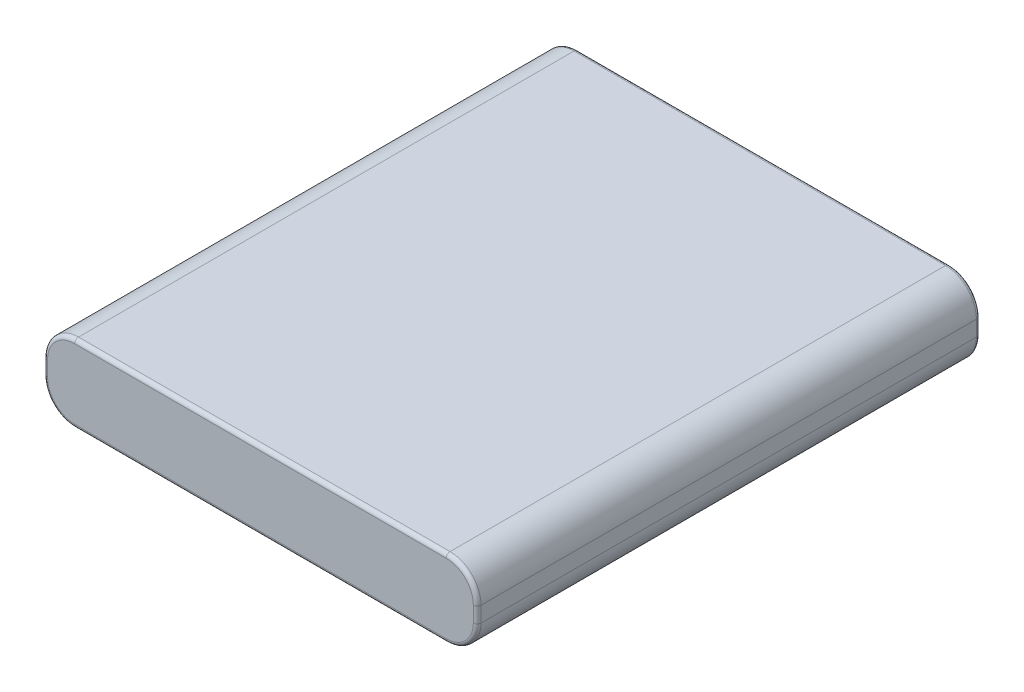
ISO-10303-21;
HEADER;
FILE_DESCRIPTION(('STEP AP214'),'2;1');
FILE_NAME('part.step','',(''),(''),'','','');
FILE_SCHEMA(('AUTOMOTIVE_DESIGN { 1 0 10303 214 1 1 1 1 }'));
ENDSEC;
DATA;
#1=APPLICATION_CONTEXT('core data for automotive mechanical design processes');
#2=APPLICATION_PROTOCOL_DEFINITION('international standard','automotive_design',2000,#1);
#3=PRODUCT_CONTEXT('',#1,'mechanical');
#4=PRODUCT('Part','Part','',(#3));
#5=PRODUCT_RELATED_PRODUCT_CATEGORY('part','',(#4));
#6=PRODUCT_DEFINITION_FORMATION('','',#4);
#7=PRODUCT_DEFINITION_CONTEXT('part definition',#1,'design');
#8=PRODUCT_DEFINITION('design','',#6,#7);
#9=PRODUCT_DEFINITION_SHAPE('','',#8);
#10=(LENGTH_UNIT() NAMED_UNIT(*) SI_UNIT(.MILLI.,.METRE.));
#11=(NAMED_UNIT(*) PLANE_ANGLE_UNIT() SI_UNIT($,.RADIAN.));
#12=(NAMED_UNIT(*) SI_UNIT($,.STERADIAN.) SOLID_ANGLE_UNIT());
#13=UNCERTAINTY_MEASURE_WITH_UNIT(LENGTH_MEASURE(1.E-05),#10,'distance_accuracy_value','');
#14=(GEOMETRIC_REPRESENTATION_CONTEXT(3) GLOBAL_UNCERTAINTY_ASSIGNED_CONTEXT((#13)) GLOBAL_UNIT_ASSIGNED_CONTEXT((#10,
#11,#12)) REPRESENTATION_CONTEXT('',''));
#15=CARTESIAN_POINT('',(0.,0.,0.));
#16=DIRECTION('',(0.,0.,1.));
#17=DIRECTION('',(1.,0.,0.));
#18=AXIS2_PLACEMENT_3D('',#15,#16,#17);
#19=CARTESIAN_POINT('',(28.,10.,-32.5));
#20=DIRECTION('',(-1.,0.,0.));
#21=DIRECTION('',(0.,0.,1.));
#22=AXIS2_PLACEMENT_3D('',#19,#20,#21);
#23=PLANE('',#22);
#24=DIRECTION('',(0.,0.,-1.));
#25=VECTOR('',#24,1.);
#26=CARTESIAN_POINT('',(28.,4.,-32.5));
#27=LINE('',#26,#25);
#28=CARTESIAN_POINT('',(28.,4.,32.));
#29=VERTEX_POINT('',#28);
#30=CARTESIAN_POINT('',(28.,4.,-32.));
#31=VERTEX_POINT('',#30);
#32=EDGE_CURVE('E279',#29,#31,#27,.T.);
#33=ORIENTED_EDGE('',*,*,#32,.T.);
#34=DIRECTION('',(0.,-1.,0.));
#35=VECTOR('',#34,1.);
#36=CARTESIAN_POINT('',(28.,10.,-32.));
#37=LINE('',#36,#35);
#38=CARTESIAN_POINT('',(28.,6.,-32.));
#39=VERTEX_POINT('',#38);
#40=EDGE_CURVE('E183',#31,#39,#37,.F.);
#41=ORIENTED_EDGE('',*,*,#40,.T.);
#42=DIRECTION('',(0.,0.,-1.));
#43=VECTOR('',#42,1.);
#44=CARTESIAN_POINT('',(28.,6.,32.5));
#45=LINE('',#44,#43);
#46=CARTESIAN_POINT('',(28.,6.,32.));
#47=VERTEX_POINT('',#46);
#48=EDGE_CURVE('E287',#39,#47,#45,.F.);
#49=ORIENTED_EDGE('',*,*,#48,.T.);
#50=DIRECTION('',(0.,-1.,0.));
#51=VECTOR('',#50,1.);
#52=CARTESIAN_POINT('',(28.,10.,32.));
#53=LINE('',#52,#51);
#54=EDGE_CURVE('E181',#47,#29,#53,.T.);
#55=ORIENTED_EDGE('',*,*,#54,.T.);
#56=EDGE_LOOP('',(#33,#41,#49,#55));
#57=FACE_BOUND('',#56,.T.);
#58=ADVANCED_FACE('F33',(#57),#23,.F.);
#59=CARTESIAN_POINT('',(-28.,10.,-32.5));
#60=DIRECTION('',(0.,0.,1.));
#61=DIRECTION('',(1.,0.,0.));
#62=AXIS2_PLACEMENT_3D('',#59,#60,#61);
#63=PLANE('',#62);
#64=DIRECTION('',(0.,-1.,0.));
#65=VECTOR('',#64,1.);
#66=CARTESIAN_POINT('',(27.5,10.,-32.5));
#67=LINE('',#66,#65);
#68=CARTESIAN_POINT('',(27.5,6.,-32.5));
#69=VERTEX_POINT('',#68);
#70=CARTESIAN_POINT('',(27.5,4.,-32.5));
#71=VERTEX_POINT('',#70);
#72=EDGE_CURVE('E171',#69,#71,#67,.T.);
#73=ORIENTED_EDGE('',*,*,#72,.T.);
#74=CARTESIAN_POINT('',(24.,4.,-32.5));
#75=DIRECTION('',(0.,0.,1.));
#76=DIRECTION('',(1.,0.,0.));
#77=AXIS2_PLACEMENT_3D('',#74,#75,#76);
#78=CIRCLE('',#77,3.5);
#79=CARTESIAN_POINT('',(24.,0.5,-32.5));
#80=VERTEX_POINT('',#79);
#81=EDGE_CURVE('E151',#71,#80,#78,.F.);
#82=ORIENTED_EDGE('',*,*,#81,.T.);
#83=DIRECTION('',(-1.,0.,0.));
#84=VECTOR('',#83,1.);
#85=CARTESIAN_POINT('',(-28.,0.5,-32.5));
#86=LINE('',#85,#84);
#87=CARTESIAN_POINT('',(-24.,0.5,-32.5));
#88=VERTEX_POINT('',#87);
#89=EDGE_CURVE('E160',#80,#88,#86,.T.);
#90=ORIENTED_EDGE('',*,*,#89,.T.);
#91=CARTESIAN_POINT('',(-24.,4.,-32.5));
#92=DIRECTION('',(0.,0.,1.));
#93=DIRECTION('',(1.,0.,0.));
#94=AXIS2_PLACEMENT_3D('',#91,#92,#93);
#95=CIRCLE('',#94,3.5);
#96=CARTESIAN_POINT('',(-27.5,4.,-32.5));
#97=VERTEX_POINT('',#96);
#98=EDGE_CURVE('E166',#88,#97,#95,.F.);
#99=ORIENTED_EDGE('',*,*,#98,.T.);
#100=DIRECTION('',(0.,-1.,0.));
#101=VECTOR('',#100,1.);
#102=CARTESIAN_POINT('',(-27.5,10.,-32.5));
#103=LINE('',#102,#101);
#104=CARTESIAN_POINT('',(-27.5,6.,-32.5));
#105=VERTEX_POINT('',#104);
#106=EDGE_CURVE('E302',#97,#105,#103,.F.);
#107=ORIENTED_EDGE('',*,*,#106,.T.);
#108=CARTESIAN_POINT('',(-24.,6.,-32.5));
#109=DIRECTION('',(0.,0.,1.));
#110=DIRECTION('',(1.,0.,0.));
#111=AXIS2_PLACEMENT_3D('',#108,#109,#110);
#112=CIRCLE('',#111,3.5);
#113=CARTESIAN_POINT('',(-24.,9.5,-32.5));
#114=VERTEX_POINT('',#113);
#115=EDGE_CURVE('E304',#105,#114,#112,.F.);
#116=ORIENTED_EDGE('',*,*,#115,.T.);
#117=DIRECTION('',(-1.,0.,0.));
#118=VECTOR('',#117,1.);
#119=CARTESIAN_POINT('',(24.,9.5,-32.5));
#120=LINE('',#119,#118);
#121=CARTESIAN_POINT('',(24.,9.5,-32.5));
#122=VERTEX_POINT('',#121);
#123=EDGE_CURVE('E306',#114,#122,#120,.F.);
#124=ORIENTED_EDGE('',*,*,#123,.T.);
#125=CARTESIAN_POINT('',(24.,6.,-32.5));
#126=DIRECTION('',(0.,0.,1.));
#127=DIRECTION('',(1.,0.,0.));
#128=AXIS2_PLACEMENT_3D('',#125,#126,#127);
#129=CIRCLE('',#128,3.5);
#130=EDGE_CURVE('E176',#122,#69,#129,.F.);
#131=ORIENTED_EDGE('',*,*,#130,.T.);
#132=EDGE_LOOP('',(#73,#82,#90,#99,#107,#116,#124,#131));
#133=FACE_BOUND('',#132,.T.);
#134=ADVANCED_FACE('F169',(#133),#63,.F.);
#135=CARTESIAN_POINT('',(-28.,10.,-32.5));
#136=DIRECTION('',(1.,0.,0.));
#137=DIRECTION('',(0.,0.,-1.));
#138=AXIS2_PLACEMENT_3D('',#135,#136,#137);
#139=PLANE('',#138);
#140=DIRECTION('',(0.,0.,1.));
#141=VECTOR('',#140,1.);
#142=CARTESIAN_POINT('',(-28.,6.,-32.5));
#143=LINE('',#142,#141);
#144=CARTESIAN_POINT('',(-28.,6.,32.));
#145=VERTEX_POINT('',#144);
#146=CARTESIAN_POINT('',(-28.,6.,-32.));
#147=VERTEX_POINT('',#146);
#148=EDGE_CURVE('E240',#145,#147,#143,.F.);
#149=ORIENTED_EDGE('',*,*,#148,.T.);
#150=DIRECTION('',(0.,-1.,0.));
#151=VECTOR('',#150,1.);
#152=CARTESIAN_POINT('',(-28.,10.,-32.));
#153=LINE('',#152,#151);
#154=CARTESIAN_POINT('',(-28.,4.,-32.));
#155=VERTEX_POINT('',#154);
#156=EDGE_CURVE('E200',#147,#155,#153,.T.);
#157=ORIENTED_EDGE('',*,*,#156,.T.);
#158=DIRECTION('',(0.,0.,1.));
#159=VECTOR('',#158,1.);
#160=CARTESIAN_POINT('',(-28.,4.,-32.5));
#161=LINE('',#160,#159);
#162=CARTESIAN_POINT('',(-28.,4.,32.));
#163=VERTEX_POINT('',#162);
#164=EDGE_CURVE('E285',#155,#163,#161,.T.);
#165=ORIENTED_EDGE('',*,*,#164,.T.);
#166=DIRECTION('',(0.,-1.,0.));
#167=VECTOR('',#166,1.);
#168=CARTESIAN_POINT('',(-28.,10.,32.));
#169=LINE('',#168,#167);
#170=EDGE_CURVE('E198',#163,#145,#169,.F.);
#171=ORIENTED_EDGE('',*,*,#170,.T.);
#172=EDGE_LOOP('',(#149,#157,#165,#171));
#173=FACE_BOUND('',#172,.T.);
#174=ADVANCED_FACE('F348',(#173),#139,.F.);
#175=CARTESIAN_POINT('',(-28.,10.,32.5));
#176=DIRECTION('',(0.,0.,-1.));
#177=DIRECTION('',(-1.,0.,0.));
#178=AXIS2_PLACEMENT_3D('',#175,#176,#177);
#179=PLANE('',#178);
#180=DIRECTION('',(1.,0.,0.));
#181=VECTOR('',#180,1.);
#182=CARTESIAN_POINT('',(-24.,9.5,32.5));
#183=LINE('',#182,#181);
#184=CARTESIAN_POINT('',(24.,9.5,32.5));
#185=VERTEX_POINT('',#184);
#186=CARTESIAN_POINT('',(-24.,9.5,32.5));
#187=VERTEX_POINT('',#186);
#188=EDGE_CURVE('E48',#185,#187,#183,.F.);
#189=ORIENTED_EDGE('',*,*,#188,.T.);
#190=CARTESIAN_POINT('',(-24.,6.,32.5));
#191=DIRECTION('',(0.,0.,-1.));
#192=DIRECTION('',(-1.,0.,0.));
#193=AXIS2_PLACEMENT_3D('',#190,#191,#192);
#194=CIRCLE('',#193,3.5);
#195=CARTESIAN_POINT('',(-27.5,6.,32.5));
#196=VERTEX_POINT('',#195);
#197=EDGE_CURVE('E41',#187,#196,#194,.F.);
#198=ORIENTED_EDGE('',*,*,#197,.T.);
#199=DIRECTION('',(0.,-1.,0.));
#200=VECTOR('',#199,1.);
#201=CARTESIAN_POINT('',(-27.5,10.,32.5));
#202=LINE('',#201,#200);
#203=CARTESIAN_POINT('',(-27.5,4.,32.5));
#204=VERTEX_POINT('',#203);
#205=EDGE_CURVE('E210',#196,#204,#202,.T.);
#206=ORIENTED_EDGE('',*,*,#205,.T.);
#207=CARTESIAN_POINT('',(-24.,4.,32.5));
#208=DIRECTION('',(0.,0.,-1.));
#209=DIRECTION('',(-1.,0.,0.));
#210=AXIS2_PLACEMENT_3D('',#207,#208,#209);
#211=CIRCLE('',#210,3.5);
#212=CARTESIAN_POINT('',(-24.,0.5,32.5));
#213=VERTEX_POINT('',#212);
#214=EDGE_CURVE('E212',#204,#213,#211,.F.);
#215=ORIENTED_EDGE('',*,*,#214,.T.);
#216=DIRECTION('',(1.,0.,0.));
#217=VECTOR('',#216,1.);
#218=CARTESIAN_POINT('',(-28.,0.5,32.5));
#219=LINE('',#218,#217);
#220=CARTESIAN_POINT('',(24.,0.5,32.5));
#221=VERTEX_POINT('',#220);
#222=EDGE_CURVE('E214',#213,#221,#219,.T.);
#223=ORIENTED_EDGE('',*,*,#222,.T.);
#224=CARTESIAN_POINT('',(24.,4.,32.5));
#225=DIRECTION('',(0.,0.,-1.));
#226=DIRECTION('',(-1.,0.,0.));
#227=AXIS2_PLACEMENT_3D('',#224,#225,#226);
#228=CIRCLE('',#227,3.5);
#229=CARTESIAN_POINT('',(27.5,4.,32.5));
#230=VERTEX_POINT('',#229);
#231=EDGE_CURVE('E216',#221,#230,#228,.F.);
#232=ORIENTED_EDGE('',*,*,#231,.T.);
#233=DIRECTION('',(0.,-1.,0.));
#234=VECTOR('',#233,1.);
#235=CARTESIAN_POINT('',(27.5,10.,32.5));
#236=LINE('',#235,#234);
#237=CARTESIAN_POINT('',(27.5,6.,32.5));
#238=VERTEX_POINT('',#237);
#239=EDGE_CURVE('E218',#230,#238,#236,.F.);
#240=ORIENTED_EDGE('',*,*,#239,.T.);
#241=CARTESIAN_POINT('',(24.,6.,32.5));
#242=DIRECTION('',(0.,0.,-1.));
#243=DIRECTION('',(-1.,0.,0.));
#244=AXIS2_PLACEMENT_3D('',#241,#242,#243);
#245=CIRCLE('',#244,3.5);
#246=EDGE_CURVE('E53',#238,#185,#245,.F.);
#247=ORIENTED_EDGE('',*,*,#246,.T.);
#248=EDGE_LOOP('',(#189,#198,#206,#215,#223,#232,#240,#247));
#249=FACE_BOUND('',#248,.T.);
#250=ADVANCED_FACE('F334',(#249),#179,.F.);
#251=CARTESIAN_POINT('',(0.,10.,0.));
#252=DIRECTION('',(0.,1.,0.));
#253=DIRECTION('',(0.,0.,1.));
#254=AXIS2_PLACEMENT_3D('',#251,#252,#253);
#255=PLANE('',#254);
#256=DIRECTION('',(0.,0.,-1.));
#257=VECTOR('',#256,1.);
#258=CARTESIAN_POINT('',(24.,10.,-32.5));
#259=LINE('',#258,#257);
#260=CARTESIAN_POINT('',(24.,10.,32.));
#261=VERTEX_POINT('',#260);
#262=CARTESIAN_POINT('',(24.,10.,-32.));
#263=VERTEX_POINT('',#262);
#264=EDGE_CURVE('E167',#261,#263,#259,.T.);
#265=ORIENTED_EDGE('',*,*,#264,.T.);
#266=DIRECTION('',(-1.,0.,0.));
#267=VECTOR('',#266,1.);
#268=CARTESIAN_POINT('',(-24.,10.,-32.));
#269=LINE('',#268,#267);
#270=CARTESIAN_POINT('',(-24.,10.,-32.));
#271=VERTEX_POINT('',#270);
#272=EDGE_CURVE('E191',#263,#271,#269,.T.);
#273=ORIENTED_EDGE('',*,*,#272,.T.);
#274=DIRECTION('',(0.,0.,1.));
#275=VECTOR('',#274,1.);
#276=CARTESIAN_POINT('',(-24.,10.,32.5));
#277=LINE('',#276,#275);
#278=CARTESIAN_POINT('',(-24.,10.,32.));
#279=VERTEX_POINT('',#278);
#280=EDGE_CURVE('E296',#271,#279,#277,.T.);
#281=ORIENTED_EDGE('',*,*,#280,.T.);
#282=DIRECTION('',(1.,0.,0.));
#283=VECTOR('',#282,1.);
#284=CARTESIAN_POINT('',(24.,10.,32.));
#285=LINE('',#284,#283);
#286=EDGE_CURVE('E189',#279,#261,#285,.T.);
#287=ORIENTED_EDGE('',*,*,#286,.T.);
#288=EDGE_LOOP('',(#265,#273,#281,#287));
#289=FACE_BOUND('',#288,.T.);
#290=ADVANCED_FACE('F369',(#289),#255,.T.);
#291=CARTESIAN_POINT('',(0.,0.,0.));
#292=DIRECTION('',(0.,1.,0.));
#293=DIRECTION('',(0.,0.,1.));
#294=AXIS2_PLACEMENT_3D('',#291,#292,#293);
#295=PLANE('',#294);
#296=CARTESIAN_POINT('',(0.,0.,6.10578674842381));
#297=DIRECTION('',(0.,1.,0.));
#298=DIRECTION('',(0.,0.,1.));
#299=AXIS2_PLACEMENT_3D('',#296,#297,#298);
#300=CIRCLE('',#299,7.);
#301=CARTESIAN_POINT('',(0.,0.,13.1057867484238));
#302=VERTEX_POINT('',#301);
#303=EDGE_CURVE('E11',#302,#302,#300,.F.);
#304=ORIENTED_EDGE('',*,*,#303,.F.);
#305=EDGE_LOOP('',(#304));
#306=FACE_BOUND('',#305,.T.);
#307=DIRECTION('',(0.,0.,1.));
#308=VECTOR('',#307,1.);
#309=CARTESIAN_POINT('',(-24.,0.,0.));
#310=LINE('',#309,#308);
#311=CARTESIAN_POINT('',(-24.,0.,32.));
#312=VERTEX_POINT('',#311);
#313=CARTESIAN_POINT('',(-24.,0.,-32.));
#314=VERTEX_POINT('',#313);
#315=EDGE_CURVE('E284',#312,#314,#310,.F.);
#316=ORIENTED_EDGE('',*,*,#315,.T.);
#317=DIRECTION('',(-1.,0.,0.));
#318=VECTOR('',#317,1.);
#319=CARTESIAN_POINT('',(0.,0.,-32.));
#320=LINE('',#319,#318);
#321=CARTESIAN_POINT('',(24.,0.,-32.));
#322=VERTEX_POINT('',#321);
#323=EDGE_CURVE('E208',#314,#322,#320,.F.);
#324=ORIENTED_EDGE('',*,*,#323,.T.);
#325=DIRECTION('',(0.,0.,-1.));
#326=VECTOR('',#325,1.);
#327=CARTESIAN_POINT('',(24.,0.,0.));
#328=LINE('',#327,#326);
#329=CARTESIAN_POINT('',(24.,0.,32.));
#330=VERTEX_POINT('',#329);
#331=EDGE_CURVE('E277',#322,#330,#328,.F.);
#332=ORIENTED_EDGE('',*,*,#331,.T.);
#333=DIRECTION('',(1.,0.,0.));
#334=VECTOR('',#333,1.);
#335=CARTESIAN_POINT('',(0.,0.,32.));
#336=LINE('',#335,#334);
#337=EDGE_CURVE('E206',#330,#312,#336,.F.);
#338=ORIENTED_EDGE('',*,*,#337,.T.);
#339=EDGE_LOOP('',(#316,#324,#332,#338));
#340=FACE_BOUND('',#339,.T.);
#341=ADVANCED_FACE('F282',(#306,#340),#295,.F.);
#342=CARTESIAN_POINT('',(-24.,4.,-32.5));
#343=DIRECTION('',(0.,0.,1.));
#344=DIRECTION('',(1.,0.,0.));
#345=AXIS2_PLACEMENT_3D('',#342,#343,#344);
#346=CYLINDRICAL_SURFACE('',#345,4.);
#347=ORIENTED_EDGE('',*,*,#164,.F.);
#348=CARTESIAN_POINT('',(-24.,4.,-32.));
#349=DIRECTION('',(0.,0.,1.));
#350=DIRECTION('',(1.,0.,0.));
#351=AXIS2_PLACEMENT_3D('',#348,#349,#350);
#352=CIRCLE('',#351,4.);
#353=EDGE_CURVE('E204',#155,#314,#352,.T.);
#354=ORIENTED_EDGE('',*,*,#353,.T.);
#355=ORIENTED_EDGE('',*,*,#315,.F.);
#356=CARTESIAN_POINT('',(-24.,4.,32.));
#357=DIRECTION('',(0.,0.,-1.));
#358=DIRECTION('',(-1.,0.,0.));
#359=AXIS2_PLACEMENT_3D('',#356,#357,#358);
#360=CIRCLE('',#359,4.);
#361=EDGE_CURVE('E202',#312,#163,#360,.T.);
#362=ORIENTED_EDGE('',*,*,#361,.T.);
#363=EDGE_LOOP('',(#347,#354,#355,#362));
#364=FACE_BOUND('',#363,.T.);
#365=ADVANCED_FACE('F368',(#364),#346,.T.);
#366=CARTESIAN_POINT('',(24.,4.,-32.5));
#367=DIRECTION('',(0.,0.,-1.));
#368=DIRECTION('',(-1.,0.,0.));
#369=AXIS2_PLACEMENT_3D('',#366,#367,#368);
#370=CYLINDRICAL_SURFACE('',#369,4.);
#371=ORIENTED_EDGE('',*,*,#331,.F.);
#372=CARTESIAN_POINT('',(24.,4.,-32.));
#373=DIRECTION('',(0.,0.,1.));
#374=DIRECTION('',(1.,0.,0.));
#375=AXIS2_PLACEMENT_3D('',#372,#373,#374);
#376=CIRCLE('',#375,4.);
#377=EDGE_CURVE('E153',#322,#31,#376,.T.);
#378=ORIENTED_EDGE('',*,*,#377,.T.);
#379=ORIENTED_EDGE('',*,*,#32,.F.);
#380=CARTESIAN_POINT('',(24.,4.,32.));
#381=DIRECTION('',(0.,0.,-1.));
#382=DIRECTION('',(-1.,0.,0.));
#383=AXIS2_PLACEMENT_3D('',#380,#381,#382);
#384=CIRCLE('',#383,4.);
#385=EDGE_CURVE('E173',#29,#330,#384,.T.);
#386=ORIENTED_EDGE('',*,*,#385,.T.);
#387=EDGE_LOOP('',(#371,#378,#379,#386));
#388=FACE_BOUND('',#387,.T.);
#389=ADVANCED_FACE('F276',(#388),#370,.T.);
#390=CARTESIAN_POINT('',(24.,6.,0.));
#391=DIRECTION('',(0.,0.,1.));
#392=DIRECTION('',(1.,0.,0.));
#393=AXIS2_PLACEMENT_3D('',#390,#391,#392);
#394=CYLINDRICAL_SURFACE('',#393,4.);
#395=ORIENTED_EDGE('',*,*,#48,.F.);
#396=CARTESIAN_POINT('',(24.,6.,-32.));
#397=DIRECTION('',(0.,0.,1.));
#398=DIRECTION('',(1.,0.,0.));
#399=AXIS2_PLACEMENT_3D('',#396,#397,#398);
#400=CIRCLE('',#399,4.);
#401=EDGE_CURVE('E187',#39,#263,#400,.T.);
#402=ORIENTED_EDGE('',*,*,#401,.T.);
#403=ORIENTED_EDGE('',*,*,#264,.F.);
#404=CARTESIAN_POINT('',(24.,6.,32.));
#405=DIRECTION('',(0.,0.,-1.));
#406=DIRECTION('',(-1.,0.,0.));
#407=AXIS2_PLACEMENT_3D('',#404,#405,#406);
#408=CIRCLE('',#407,4.);
#409=EDGE_CURVE('E185',#261,#47,#408,.T.);
#410=ORIENTED_EDGE('',*,*,#409,.T.);
#411=EDGE_LOOP('',(#395,#402,#403,#410));
#412=FACE_BOUND('',#411,.T.);
#413=ADVANCED_FACE('F320',(#412),#394,.T.);
#414=CARTESIAN_POINT('',(-24.,6.,0.));
#415=DIRECTION('',(0.,0.,-1.));
#416=DIRECTION('',(-1.,0.,0.));
#417=AXIS2_PLACEMENT_3D('',#414,#415,#416);
#418=CYLINDRICAL_SURFACE('',#417,4.);
#419=ORIENTED_EDGE('',*,*,#280,.F.);
#420=CARTESIAN_POINT('',(-24.,6.,-32.));
#421=DIRECTION('',(0.,0.,1.));
#422=DIRECTION('',(1.,0.,0.));
#423=AXIS2_PLACEMENT_3D('',#420,#421,#422);
#424=CIRCLE('',#423,4.);
#425=EDGE_CURVE('E196',#271,#147,#424,.T.);
#426=ORIENTED_EDGE('',*,*,#425,.T.);
#427=ORIENTED_EDGE('',*,*,#148,.F.);
#428=CARTESIAN_POINT('',(-24.,6.,32.));
#429=DIRECTION('',(0.,0.,-1.));
#430=DIRECTION('',(-1.,0.,0.));
#431=AXIS2_PLACEMENT_3D('',#428,#429,#430);
#432=CIRCLE('',#431,4.);
#433=EDGE_CURVE('E193',#145,#279,#432,.T.);
#434=ORIENTED_EDGE('',*,*,#433,.T.);
#435=EDGE_LOOP('',(#419,#426,#427,#434));
#436=FACE_BOUND('',#435,.T.);
#437=ADVANCED_FACE('F353',(#436),#418,.T.);
#438=CARTESIAN_POINT('',(-24.,6.,-32.));
#439=DIRECTION('',(0.,0.,1.));
#440=DIRECTION('',(1.,0.,0.));
#441=AXIS2_PLACEMENT_3D('',#438,#439,#440);
#442=TOROIDAL_SURFACE('',#441,3.5,0.5);
#443=CARTESIAN_POINT('',(-27.5,6.,-32.));
#444=DIRECTION('',(0.,-1.,0.));
#445=DIRECTION('',(0.,0.,-1.));
#446=AXIS2_PLACEMENT_3D('',#443,#444,#445);
#447=CIRCLE('',#446,0.5);
#448=EDGE_CURVE('E234',#147,#105,#447,.T.);
#449=ORIENTED_EDGE('',*,*,#448,.F.);
#450=ORIENTED_EDGE('',*,*,#425,.F.);
#451=CARTESIAN_POINT('',(-24.,9.5,-32.));
#452=DIRECTION('',(1.,0.,0.));
#453=DIRECTION('',(0.,0.,-1.));
#454=AXIS2_PLACEMENT_3D('',#451,#452,#453);
#455=CIRCLE('',#454,0.5);
#456=EDGE_CURVE('E237',#114,#271,#455,.T.);
#457=ORIENTED_EDGE('',*,*,#456,.F.);
#458=ORIENTED_EDGE('',*,*,#115,.F.);
#459=EDGE_LOOP('',(#449,#450,#457,#458));
#460=FACE_BOUND('',#459,.T.);
#461=ADVANCED_FACE('F394',(#460),#442,.T.);
#462=CARTESIAN_POINT('',(0.,9.5,-32.));
#463=DIRECTION('',(1.,0.,0.));
#464=DIRECTION('',(0.,0.,-1.));
#465=AXIS2_PLACEMENT_3D('',#462,#463,#464);
#466=CYLINDRICAL_SURFACE('',#465,0.5);
#467=ORIENTED_EDGE('',*,*,#456,.T.);
#468=ORIENTED_EDGE('',*,*,#272,.F.);
#469=CARTESIAN_POINT('',(24.,9.5,-32.));
#470=DIRECTION('',(1.,0.,0.));
#471=DIRECTION('',(0.,0.,-1.));
#472=AXIS2_PLACEMENT_3D('',#469,#470,#471);
#473=CIRCLE('',#472,0.5);
#474=EDGE_CURVE('E231',#122,#263,#473,.T.);
#475=ORIENTED_EDGE('',*,*,#474,.F.);
#476=ORIENTED_EDGE('',*,*,#123,.F.);
#477=EDGE_LOOP('',(#467,#468,#475,#476));
#478=FACE_BOUND('',#477,.T.);
#479=ADVANCED_FACE('F410',(#478),#466,.T.);
#480=CARTESIAN_POINT('',(-27.5,10.,-32.));
#481=DIRECTION('',(0.,-1.,0.));
#482=DIRECTION('',(0.,0.,-1.));
#483=AXIS2_PLACEMENT_3D('',#480,#481,#482);
#484=CYLINDRICAL_SURFACE('',#483,0.5);
#485=ORIENTED_EDGE('',*,*,#448,.T.);
#486=ORIENTED_EDGE('',*,*,#106,.F.);
#487=CARTESIAN_POINT('',(-27.5,4.,-32.));
#488=DIRECTION('',(0.,-1.,0.));
#489=DIRECTION('',(0.,0.,-1.));
#490=AXIS2_PLACEMENT_3D('',#487,#488,#489);
#491=CIRCLE('',#490,0.5);
#492=EDGE_CURVE('E228',#155,#97,#491,.T.);
#493=ORIENTED_EDGE('',*,*,#492,.F.);
#494=ORIENTED_EDGE('',*,*,#156,.F.);
#495=EDGE_LOOP('',(#485,#486,#493,#494));
#496=FACE_BOUND('',#495,.T.);
#497=ADVANCED_FACE('F407',(#496),#484,.T.);
#498=CARTESIAN_POINT('',(24.,6.,-32.));
#499=DIRECTION('',(0.,0.,1.));
#500=DIRECTION('',(1.,0.,0.));
#501=AXIS2_PLACEMENT_3D('',#498,#499,#500);
#502=TOROIDAL_SURFACE('',#501,3.5,0.5);
#503=ORIENTED_EDGE('',*,*,#474,.T.);
#504=ORIENTED_EDGE('',*,*,#401,.F.);
#505=CARTESIAN_POINT('',(27.5,6.,-32.));
#506=DIRECTION('',(0.,-1.,0.));
#507=DIRECTION('',(0.,0.,-1.));
#508=AXIS2_PLACEMENT_3D('',#505,#506,#507);
#509=CIRCLE('',#508,0.5);
#510=EDGE_CURVE('E225',#69,#39,#509,.T.);
#511=ORIENTED_EDGE('',*,*,#510,.F.);
#512=ORIENTED_EDGE('',*,*,#130,.F.);
#513=EDGE_LOOP('',(#503,#504,#511,#512));
#514=FACE_BOUND('',#513,.T.);
#515=ADVANCED_FACE('F313',(#514),#502,.T.);
#516=CARTESIAN_POINT('',(-24.,4.,-32.));
#517=DIRECTION('',(0.,0.,1.));
#518=DIRECTION('',(1.,0.,0.));
#519=AXIS2_PLACEMENT_3D('',#516,#517,#518);
#520=TOROIDAL_SURFACE('',#519,3.5,0.5);
#521=ORIENTED_EDGE('',*,*,#492,.T.);
#522=ORIENTED_EDGE('',*,*,#98,.F.);
#523=CARTESIAN_POINT('',(-24.,0.5,-32.));
#524=DIRECTION('',(1.,0.,0.));
#525=DIRECTION('',(0.,0.,-1.));
#526=AXIS2_PLACEMENT_3D('',#523,#524,#525);
#527=CIRCLE('',#526,0.5);
#528=EDGE_CURVE('E163',#314,#88,#527,.T.);
#529=ORIENTED_EDGE('',*,*,#528,.F.);
#530=ORIENTED_EDGE('',*,*,#353,.F.);
#531=EDGE_LOOP('',(#521,#522,#529,#530));
#532=FACE_BOUND('',#531,.T.);
#533=ADVANCED_FACE('F401',(#532),#520,.T.);
#534=CARTESIAN_POINT('',(27.5,10.,-32.));
#535=DIRECTION('',(0.,-1.,0.));
#536=DIRECTION('',(0.,0.,-1.));
#537=AXIS2_PLACEMENT_3D('',#534,#535,#536);
#538=CYLINDRICAL_SURFACE('',#537,0.5);
#539=ORIENTED_EDGE('',*,*,#510,.T.);
#540=ORIENTED_EDGE('',*,*,#40,.F.);
#541=CARTESIAN_POINT('',(27.5,4.,-32.));
#542=DIRECTION('',(0.,-1.,0.));
#543=DIRECTION('',(0.,0.,-1.));
#544=AXIS2_PLACEMENT_3D('',#541,#542,#543);
#545=CIRCLE('',#544,0.5);
#546=EDGE_CURVE('E156',#71,#31,#545,.T.);
#547=ORIENTED_EDGE('',*,*,#546,.F.);
#548=ORIENTED_EDGE('',*,*,#72,.F.);
#549=EDGE_LOOP('',(#539,#540,#547,#548));
#550=FACE_BOUND('',#549,.T.);
#551=ADVANCED_FACE('F316',(#550),#538,.T.);
#552=CARTESIAN_POINT('',(-28.,0.5,-32.));
#553=DIRECTION('',(-1.,0.,0.));
#554=DIRECTION('',(0.,0.,1.));
#555=AXIS2_PLACEMENT_3D('',#552,#553,#554);
#556=CYLINDRICAL_SURFACE('',#555,0.5);
#557=ORIENTED_EDGE('',*,*,#528,.T.);
#558=ORIENTED_EDGE('',*,*,#89,.F.);
#559=CARTESIAN_POINT('',(24.,0.5,-32.));
#560=DIRECTION('',(1.,0.,0.));
#561=DIRECTION('',(0.,0.,-1.));
#562=AXIS2_PLACEMENT_3D('',#559,#560,#561);
#563=CIRCLE('',#562,0.5);
#564=EDGE_CURVE('E147',#322,#80,#563,.T.);
#565=ORIENTED_EDGE('',*,*,#564,.F.);
#566=ORIENTED_EDGE('',*,*,#323,.F.);
#567=EDGE_LOOP('',(#557,#558,#565,#566));
#568=FACE_BOUND('',#567,.T.);
#569=ADVANCED_FACE('F161',(#568),#556,.T.);
#570=CARTESIAN_POINT('',(24.,4.,-32.));
#571=DIRECTION('',(0.,0.,1.));
#572=DIRECTION('',(1.,0.,0.));
#573=AXIS2_PLACEMENT_3D('',#570,#571,#572);
#574=TOROIDAL_SURFACE('',#573,3.5,0.5);
#575=ORIENTED_EDGE('',*,*,#546,.T.);
#576=ORIENTED_EDGE('',*,*,#377,.F.);
#577=ORIENTED_EDGE('',*,*,#564,.T.);
#578=ORIENTED_EDGE('',*,*,#81,.F.);
#579=EDGE_LOOP('',(#575,#576,#577,#578));
#580=FACE_BOUND('',#579,.T.);
#581=ADVANCED_FACE('F149',(#580),#574,.T.);
#582=CARTESIAN_POINT('',(24.,4.,32.));
#583=DIRECTION('',(0.,0.,-1.));
#584=DIRECTION('',(-1.,0.,0.));
#585=AXIS2_PLACEMENT_3D('',#582,#583,#584);
#586=TOROIDAL_SURFACE('',#585,3.5,0.5);
#587=CARTESIAN_POINT('',(24.,0.5,32.));
#588=DIRECTION('',(-1.,0.,0.));
#589=DIRECTION('',(0.,0.,1.));
#590=AXIS2_PLACEMENT_3D('',#587,#588,#589);
#591=CIRCLE('',#590,0.5);
#592=EDGE_CURVE('E258',#330,#221,#591,.T.);
#593=ORIENTED_EDGE('',*,*,#592,.F.);
#594=ORIENTED_EDGE('',*,*,#385,.F.);
#595=CARTESIAN_POINT('',(27.5,4.,32.));
#596=DIRECTION('',(0.,1.,0.));
#597=DIRECTION('',(0.,0.,1.));
#598=AXIS2_PLACEMENT_3D('',#595,#596,#597);
#599=CIRCLE('',#598,0.5);
#600=EDGE_CURVE('E157',#230,#29,#599,.T.);
#601=ORIENTED_EDGE('',*,*,#600,.F.);
#602=ORIENTED_EDGE('',*,*,#231,.F.);
#603=EDGE_LOOP('',(#593,#594,#601,#602));
#604=FACE_BOUND('',#603,.T.);
#605=ADVANCED_FACE('F35',(#604),#586,.T.);
#606=CARTESIAN_POINT('',(27.5,10.,32.));
#607=DIRECTION('',(0.,-1.,0.));
#608=DIRECTION('',(0.,0.,-1.));
#609=AXIS2_PLACEMENT_3D('',#606,#607,#608);
#610=CYLINDRICAL_SURFACE('',#609,0.5);
#611=ORIENTED_EDGE('',*,*,#600,.T.);
#612=ORIENTED_EDGE('',*,*,#54,.F.);
#613=CARTESIAN_POINT('',(27.5,6.,32.));
#614=DIRECTION('',(0.,1.,0.));
#615=DIRECTION('',(0.,0.,1.));
#616=AXIS2_PLACEMENT_3D('',#613,#614,#615);
#617=CIRCLE('',#616,0.5);
#618=EDGE_CURVE('E255',#238,#47,#617,.T.);
#619=ORIENTED_EDGE('',*,*,#618,.F.);
#620=ORIENTED_EDGE('',*,*,#239,.F.);
#621=EDGE_LOOP('',(#611,#612,#619,#620));
#622=FACE_BOUND('',#621,.T.);
#623=ADVANCED_FACE('F265',(#622),#610,.T.);
#624=CARTESIAN_POINT('',(-28.,0.5,32.));
#625=DIRECTION('',(1.,0.,0.));
#626=DIRECTION('',(0.,0.,-1.));
#627=AXIS2_PLACEMENT_3D('',#624,#625,#626);
#628=CYLINDRICAL_SURFACE('',#627,0.5);
#629=ORIENTED_EDGE('',*,*,#592,.T.);
#630=ORIENTED_EDGE('',*,*,#222,.F.);
#631=CARTESIAN_POINT('',(-24.,0.5,32.));
#632=DIRECTION('',(-1.,0.,0.));
#633=DIRECTION('',(0.,0.,1.));
#634=AXIS2_PLACEMENT_3D('',#631,#632,#633);
#635=CIRCLE('',#634,0.5);
#636=EDGE_CURVE('E252',#312,#213,#635,.T.);
#637=ORIENTED_EDGE('',*,*,#636,.F.);
#638=ORIENTED_EDGE('',*,*,#337,.F.);
#639=EDGE_LOOP('',(#629,#630,#637,#638));
#640=FACE_BOUND('',#639,.T.);
#641=ADVANCED_FACE('F428',(#640),#628,.T.);
#642=CARTESIAN_POINT('',(24.,6.,32.));
#643=DIRECTION('',(0.,0.,-1.));
#644=DIRECTION('',(-1.,0.,0.));
#645=AXIS2_PLACEMENT_3D('',#642,#643,#644);
#646=TOROIDAL_SURFACE('',#645,3.5,0.5);
#647=ORIENTED_EDGE('',*,*,#618,.T.);
#648=ORIENTED_EDGE('',*,*,#409,.F.);
#649=CARTESIAN_POINT('',(24.,9.5,32.));
#650=DIRECTION('',(-1.,0.,0.));
#651=DIRECTION('',(0.,0.,1.));
#652=AXIS2_PLACEMENT_3D('',#649,#650,#651);
#653=CIRCLE('',#652,0.5);
#654=EDGE_CURVE('E249',#185,#261,#653,.T.);
#655=ORIENTED_EDGE('',*,*,#654,.F.);
#656=ORIENTED_EDGE('',*,*,#246,.F.);
#657=EDGE_LOOP('',(#647,#648,#655,#656));
#658=FACE_BOUND('',#657,.T.);
#659=ADVANCED_FACE('F324',(#658),#646,.T.);
#660=CARTESIAN_POINT('',(-24.,4.,32.));
#661=DIRECTION('',(0.,0.,-1.));
#662=DIRECTION('',(-1.,0.,0.));
#663=AXIS2_PLACEMENT_3D('',#660,#661,#662);
#664=TOROIDAL_SURFACE('',#663,3.5,0.5);
#665=ORIENTED_EDGE('',*,*,#636,.T.);
#666=ORIENTED_EDGE('',*,*,#214,.F.);
#667=CARTESIAN_POINT('',(-27.5,4.,32.));
#668=DIRECTION('',(0.,1.,0.));
#669=DIRECTION('',(0.,0.,1.));
#670=AXIS2_PLACEMENT_3D('',#667,#668,#669);
#671=CIRCLE('',#670,0.5);
#672=EDGE_CURVE('E246',#163,#204,#671,.T.);
#673=ORIENTED_EDGE('',*,*,#672,.F.);
#674=ORIENTED_EDGE('',*,*,#361,.F.);
#675=EDGE_LOOP('',(#665,#666,#673,#674));
#676=FACE_BOUND('',#675,.T.);
#677=ADVANCED_FACE('F340',(#676),#664,.T.);
#678=CARTESIAN_POINT('',(0.,9.5,32.));
#679=DIRECTION('',(-1.,0.,0.));
#680=DIRECTION('',(0.,0.,1.));
#681=AXIS2_PLACEMENT_3D('',#678,#679,#680);
#682=CYLINDRICAL_SURFACE('',#681,0.5);
#683=ORIENTED_EDGE('',*,*,#654,.T.);
#684=ORIENTED_EDGE('',*,*,#286,.F.);
#685=CARTESIAN_POINT('',(-24.,9.5,32.));
#686=DIRECTION('',(-1.,0.,0.));
#687=DIRECTION('',(0.,0.,1.));
#688=AXIS2_PLACEMENT_3D('',#685,#686,#687);
#689=CIRCLE('',#688,0.5);
#690=EDGE_CURVE('E243',#187,#279,#689,.T.);
#691=ORIENTED_EDGE('',*,*,#690,.F.);
#692=ORIENTED_EDGE('',*,*,#188,.F.);
#693=EDGE_LOOP('',(#683,#684,#691,#692));
#694=FACE_BOUND('',#693,.T.);
#695=ADVANCED_FACE('F327',(#694),#682,.T.);
#696=CARTESIAN_POINT('',(-27.5,10.,32.));
#697=DIRECTION('',(0.,-1.,0.));
#698=DIRECTION('',(0.,0.,-1.));
#699=AXIS2_PLACEMENT_3D('',#696,#697,#698);
#700=CYLINDRICAL_SURFACE('',#699,0.5);
#701=ORIENTED_EDGE('',*,*,#672,.T.);
#702=ORIENTED_EDGE('',*,*,#205,.F.);
#703=CARTESIAN_POINT('',(-27.5,6.,32.));
#704=DIRECTION('',(0.,1.,0.));
#705=DIRECTION('',(0.,0.,1.));
#706=AXIS2_PLACEMENT_3D('',#703,#704,#705);
#707=CIRCLE('',#706,0.5);
#708=EDGE_CURVE('E241',#145,#196,#707,.T.);
#709=ORIENTED_EDGE('',*,*,#708,.F.);
#710=ORIENTED_EDGE('',*,*,#170,.F.);
#711=EDGE_LOOP('',(#701,#702,#709,#710));
#712=FACE_BOUND('',#711,.T.);
#713=ADVANCED_FACE('F344',(#712),#700,.T.);
#714=CARTESIAN_POINT('',(-24.,6.,32.));
#715=DIRECTION('',(0.,0.,-1.));
#716=DIRECTION('',(-1.,0.,0.));
#717=AXIS2_PLACEMENT_3D('',#714,#715,#716);
#718=TOROIDAL_SURFACE('',#717,3.5,0.5);
#719=ORIENTED_EDGE('',*,*,#690,.T.);
#720=ORIENTED_EDGE('',*,*,#433,.F.);
#721=ORIENTED_EDGE('',*,*,#708,.T.);
#722=ORIENTED_EDGE('',*,*,#197,.F.);
#723=EDGE_LOOP('',(#719,#720,#721,#722));
#724=FACE_BOUND('',#723,.T.);
#725=ADVANCED_FACE('F331',(#724),#718,.T.);
#726=CARTESIAN_POINT('',(0.,-2.,6.10578674842381));
#727=DIRECTION('',(0.,1.,0.));
#728=DIRECTION('',(0.,0.,1.));
#729=AXIS2_PLACEMENT_3D('',#726,#727,#728);
#730=CYLINDRICAL_SURFACE('',#729,7.);
#731=CARTESIAN_POINT('',(0.,-2.,6.10578674842381));
#732=DIRECTION('',(0.,-1.,0.));
#733=DIRECTION('',(0.,0.,-1.));
#734=AXIS2_PLACEMENT_3D('',#731,#732,#733);
#735=CIRCLE('',#734,7.);
#736=CARTESIAN_POINT('',(0.,-2.,-0.894213251576189));
#737=VERTEX_POINT('',#736);
#738=EDGE_CURVE('E244',#737,#737,#735,.T.);
#739=ORIENTED_EDGE('',*,*,#738,.F.);
#740=EDGE_LOOP('',(#739));
#741=FACE_BOUND('',#740,.T.);
#742=ORIENTED_EDGE('',*,*,#303,.T.);
#743=EDGE_LOOP('',(#742));
#744=FACE_BOUND('',#743,.T.);
#745=ADVANCED_FACE('F361',(#741,#744),#730,.T.);
#746=CARTESIAN_POINT('',(0.,-2.,6.10578674842381));
#747=DIRECTION('',(0.,-1.,0.));
#748=DIRECTION('',(0.,0.,-1.));
#749=AXIS2_PLACEMENT_3D('',#746,#747,#748);
#750=PLANE('',#749);
#751=ORIENTED_EDGE('',*,*,#738,.T.);
#752=EDGE_LOOP('',(#751));
#753=FACE_BOUND('',#752,.T.);
#754=ADVANCED_FACE('F359',(#753),#750,.T.);
#755=CLOSED_SHELL('',(#58,#134,#174,#250,#290,#341,#365,#389,#413,#437,#461,#479,#497,#515,#533,
#551,#569,#581,#605,#623,#641,#659,#677,#695,#713,#725,#745,#754));
#756=MANIFOLD_SOLID_BREP('B2',#755);
#757=ADVANCED_BREP_SHAPE_REPRESENTATION('',(#18,#756),#14);
#758=SHAPE_DEFINITION_REPRESENTATION(#9,#757);
ENDSEC;
END-ISO-10303-21;
